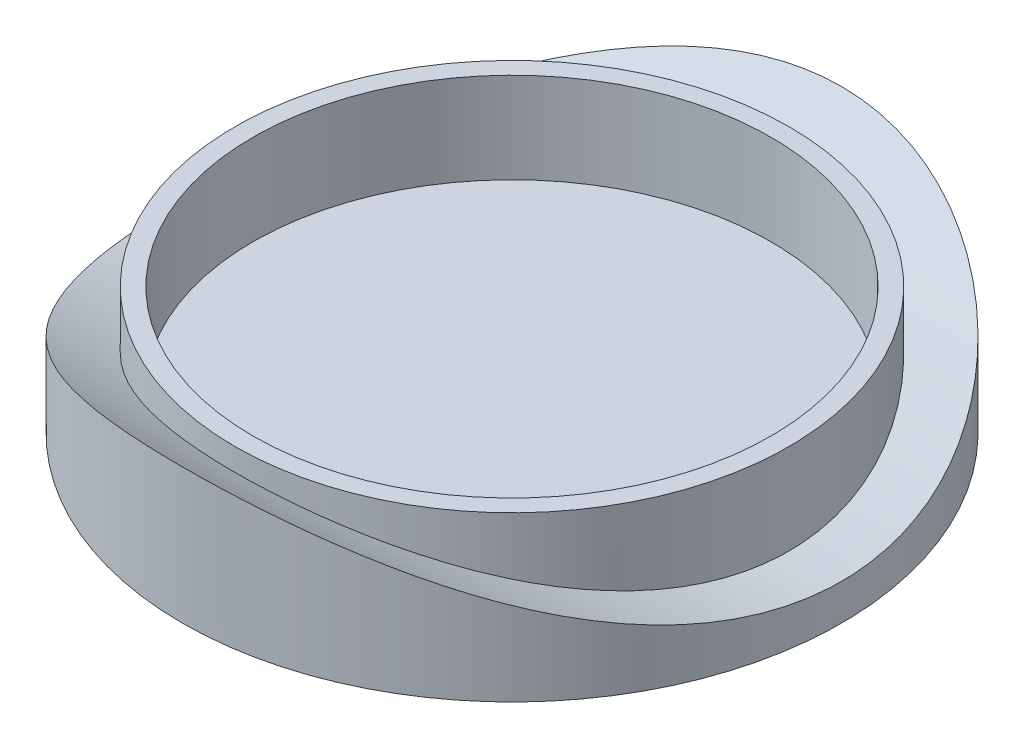
ISO-10303-21;
HEADER;
FILE_DESCRIPTION(('STEP AP214'),'2;1');
FILE_NAME('part.step','',(''),(''),'','','');
FILE_SCHEMA(('AUTOMOTIVE_DESIGN { 1 0 10303 214 1 1 1 1 }'));
ENDSEC;
DATA;
#1=APPLICATION_CONTEXT('core data for automotive mechanical design processes');
#2=APPLICATION_PROTOCOL_DEFINITION('international standard','automotive_design',2000,#1);
#3=PRODUCT_CONTEXT('',#1,'mechanical');
#4=PRODUCT('Part','Part','',(#3));
#5=PRODUCT_RELATED_PRODUCT_CATEGORY('part','',(#4));
#6=PRODUCT_DEFINITION_FORMATION('','',#4);
#7=PRODUCT_DEFINITION_CONTEXT('part definition',#1,'design');
#8=PRODUCT_DEFINITION('design','',#6,#7);
#9=PRODUCT_DEFINITION_SHAPE('','',#8);
#10=(LENGTH_UNIT() NAMED_UNIT(*) SI_UNIT(.MILLI.,.METRE.));
#11=(NAMED_UNIT(*) PLANE_ANGLE_UNIT() SI_UNIT($,.RADIAN.));
#12=(NAMED_UNIT(*) SI_UNIT($,.STERADIAN.) SOLID_ANGLE_UNIT());
#13=UNCERTAINTY_MEASURE_WITH_UNIT(LENGTH_MEASURE(1.E-05),#10,'distance_accuracy_value','');
#14=(GEOMETRIC_REPRESENTATION_CONTEXT(3) GLOBAL_UNCERTAINTY_ASSIGNED_CONTEXT((#13)) GLOBAL_UNIT_ASSIGNED_CONTEXT((#10,
#11,#12)) REPRESENTATION_CONTEXT('',''));
#15=CARTESIAN_POINT('',(0.,0.,0.));
#16=DIRECTION('',(0.,0.,1.));
#17=DIRECTION('',(1.,0.,0.));
#18=AXIS2_PLACEMENT_3D('',#15,#16,#17);
#19=CARTESIAN_POINT('',(-18.2,35.,0.));
#20=DIRECTION('',(1.,0.,0.));
#21=DIRECTION('',(0.,0.,-1.));
#22=AXIS2_PLACEMENT_3D('',#19,#20,#21);
#23=CYLINDRICAL_SURFACE('',#22,33.);
#24=CARTESIAN_POINT('',(0.,7.4725591454636,-18.2));
#25=CARTESIAN_POINT('',(0.466331520188418,7.47256646341348,-18.2000054410656));
#26=CARTESIAN_POINT('',(0.932604670972832,7.46067141752008,-18.1820565257804));
#27=CARTESIAN_POINT('',(1.86139151814629,7.41359579888765,-18.1105540895834));
#28=CARTESIAN_POINT('',(2.32390395310295,7.37840771486212,-18.0569890835557));
#29=CARTESIAN_POINT('',(3.24195847486375,7.28608086767691,-17.9149607667867));
#30=CARTESIAN_POINT('',(3.69748961472007,7.22891069860615,-17.8264475204406));
#31=CARTESIAN_POINT('',(4.59766027526353,7.0947971142261,-17.6157658458414));
#32=CARTESIAN_POINT('',(5.04230035022069,7.01785470746872,-17.4935991341776));
#33=CARTESIAN_POINT('',(5.91517444234529,6.84743012429949,-17.2179804127475));
#34=CARTESIAN_POINT('',(6.34349645350872,6.75405893954419,-17.0647373544043));
#35=CARTESIAN_POINT('',(7.18480607907141,6.55330512441851,-16.7279398202997));
#36=CARTESIAN_POINT('',(7.597787975018,6.44591733498856,-16.5443741771347));
#37=CARTESIAN_POINT('',(8.40651496232948,6.22016850840954,-16.1484734732091));
#38=CARTESIAN_POINT('',(8.80226175438158,6.10180855756935,-15.9361412595506));
#39=CARTESIAN_POINT('',(9.57517128492063,5.85708493057837,-15.4840744444795));
#40=CARTESIAN_POINT('',(9.95233338708389,5.73072098071566,-15.2443389057323));
#41=CARTESIAN_POINT('',(10.7242893595588,5.45974325762081,-14.7129529266069));
#42=CARTESIAN_POINT('',(11.1169653754086,5.31458171690369,-14.4185017697951));
#43=CARTESIAN_POINT('',(11.8766365811248,5.02181354003542,-13.7994759938546));
#44=CARTESIAN_POINT('',(12.2436377859735,4.87420748666322,-13.4749084719873));
#45=CARTESIAN_POINT('',(12.9507748260143,4.57995511049256,-12.7967792018255));
#46=CARTESIAN_POINT('',(13.2908914159621,4.43330954290588,-12.4431970460118));
#47=CARTESIAN_POINT('',(13.9423021461093,4.1444890019993,-11.708680073825));
#48=CARTESIAN_POINT('',(14.2535951449645,4.00231420585817,-11.3277441753697));
#49=CARTESIAN_POINT('',(14.8711957592552,3.71371572957544,-10.5059080717827));
#50=CARTESIAN_POINT('',(15.1747332270049,3.56799167749868,-10.0626722041972));
#51=CARTESIAN_POINT('',(15.7430523704397,3.28971293938486,-9.14801580400674));
#52=CARTESIAN_POINT('',(16.0078312084888,3.15715921781537,-8.67659321132198));
#53=CARTESIAN_POINT('',(16.4957435322228,2.90910656546688,-7.70869376662923));
#54=CARTESIAN_POINT('',(16.7189013479963,2.79359767921562,-7.21223176873179));
#55=CARTESIAN_POINT('',(17.1209903462412,2.58304532127191,-6.19753072550103));
#56=CARTESIAN_POINT('',(17.2999274522119,2.48799910876174,-5.6792946077708));
#57=CARTESIAN_POINT('',(17.5980386039285,2.32835333043952,-4.66933163655679));
#58=CARTESIAN_POINT('',(17.7209558586151,2.26187386896676,-4.17900571232701));
#59=CARTESIAN_POINT('',(17.9258583545083,2.15051019976615,-3.18744773977156));
#60=CARTESIAN_POINT('',(18.0078456817139,2.10562489149375,-2.6862162486085));
#61=CARTESIAN_POINT('',(18.1296465655529,2.03878805533231,-1.67745814802569));
#62=CARTESIAN_POINT('',(18.1694870977608,2.01682185845152,-1.16993577574481));
#63=CARTESIAN_POINT('',(18.2064686362156,1.99643587036973,-0.152881085806326));
#64=CARTESIAN_POINT('',(18.2036130499454,1.998014200132,0.356651068210303));
#65=CARTESIAN_POINT('',(18.1578175109985,2.02324970685733,1.3194229158806));
#66=CARTESIAN_POINT('',(18.119134909063,2.04456183434509,1.77293443658919));
#67=CARTESIAN_POINT('',(18.0081391221105,2.10545768786817,2.67454474628199));
#68=CARTESIAN_POINT('',(17.9358288392585,2.14503983714615,3.12264399893719));
#69=CARTESIAN_POINT('',(17.7584244751602,2.24154903593377,4.01039745265964));
#70=CARTESIAN_POINT('',(17.6533292311395,2.29847670062991,4.45005135361096));
#71=CARTESIAN_POINT('',(17.4115037003696,2.42838557399743,5.31813637426397));
#72=CARTESIAN_POINT('',(17.2747721805998,2.50136740837293,5.74656705581716));
#73=CARTESIAN_POINT('',(16.9694331506945,2.66264260918343,6.59419563976168));
#74=CARTESIAN_POINT('',(16.8005044362565,2.75108945152799,7.0132483682451));
#75=CARTESIAN_POINT('',(16.4332620842467,2.94087654696213,7.83521158087485));
#76=CARTESIAN_POINT('',(16.2349485909342,3.04221673675378,8.23812214425591));
#77=CARTESIAN_POINT('',(15.8104557005801,3.25575867817724,9.02606227963806));
#78=CARTESIAN_POINT('',(15.5842709947826,3.36796249817898,9.41108842582278));
#79=CARTESIAN_POINT('',(15.105579579088,3.60103776162541,10.1616750929136));
#80=CARTESIAN_POINT('',(14.8530704269851,3.72191000894349,10.5272338029999));
#81=CARTESIAN_POINT('',(14.2944895390302,3.98347059500395,11.2760239171027));
#82=CARTESIAN_POINT('',(13.9855785605702,4.12488770010289,11.6568853601896));
#83=CARTESIAN_POINT('',(13.3390263766242,4.41232652693227,12.3915234235819));
#84=CARTESIAN_POINT('',(13.0013833824372,4.55834853498255,12.7452983550184));
#85=CARTESIAN_POINT('',(12.2986876354565,4.85177117612977,13.4246540084065));
#86=CARTESIAN_POINT('',(11.933608395292,4.99917301800046,13.7502068141785));
#87=CARTESIAN_POINT('',(11.1778761020166,5.29169270866319,14.3713024684439));
#88=CARTESIAN_POINT('',(10.7872218922903,5.43681045378945,14.6668439581464));
#89=CARTESIAN_POINT('',(9.94608237685257,5.73370042260822,15.2512439522224));
#90=CARTESIAN_POINT('',(9.49336420834066,5.88491993188558,15.5371806535685));
#91=CARTESIAN_POINT('',(8.56147385049909,6.17530808595798,16.0695088704479));
#92=CARTESIAN_POINT('',(8.08229944015019,6.31447571646303,16.3158970590521));
#93=CARTESIAN_POINT('',(7.10047577579676,6.5754843352139,16.7664749397714));
#94=CARTESIAN_POINT('',(6.59784861437138,6.6973412093552,16.9707034004551));
#95=CARTESIAN_POINT('',(5.571962239076,6.91875775355617,17.3346271450477));
#96=CARTESIAN_POINT('',(5.0487063785315,7.0183210301481,17.4943296331431));
#97=CARTESIAN_POINT('',(4.02858433208946,7.18351217743513,17.7557022457545));
#98=CARTESIAN_POINT('',(3.53299042666581,7.25122845215653,17.8610123105251));
#99=CARTESIAN_POINT('',(2.53193071754668,7.36083722527409,18.0301667106052));
#100=CARTESIAN_POINT('',(2.02646555237618,7.40273138830951,18.0940137188719));
#101=CARTESIAN_POINT('',(1.01091804605277,7.4586641785897,18.1790382773901));
#102=CARTESIAN_POINT('',(0.500840789013534,7.47273042924424,18.2002581418486));
#103=CARTESIAN_POINT('',(-0.519253461440173,7.47238478291506,18.1997372014224));
#104=CARTESIAN_POINT('',(-1.02927045528828,7.45797603113853,18.1780011412357));
#105=CARTESIAN_POINT('',(-1.96955013237164,7.40557967593698,18.0983357117135));
#106=CARTESIAN_POINT('',(-2.4005310795556,7.37136343551335,18.0461871345147));
#107=CARTESIAN_POINT('',(-3.25573863544294,7.28395852691672,17.9116578081477));
#108=CARTESIAN_POINT('',(-3.67996604753212,7.23077213327748,17.829280683368));
#109=CARTESIAN_POINT('',(-4.51923461512074,7.10715018874479,17.6352524243006));
#110=CARTESIAN_POINT('',(-4.93427242137065,7.03670845822746,17.5235908013922));
#111=CARTESIAN_POINT('',(-5.75283641699896,6.88072477344661,17.2721805606715));
#112=CARTESIAN_POINT('',(-6.15636180473914,6.79518177061065,17.1324299923809));
#113=CARTESIAN_POINT('',(-6.96659455394913,6.60754159059913,16.8197176655141));
#114=CARTESIAN_POINT('',(-7.37273586985196,6.50490376888353,16.645616103698));
#115=CARTESIAN_POINT('',(-8.16905829221269,6.28856368702168,16.2696179723184));
#116=CARTESIAN_POINT('',(-8.55923273988248,6.1748568761528,16.0677099565975));
#117=CARTESIAN_POINT('',(-9.32216444175939,5.93918312249585,15.6374258237048));
#118=CARTESIAN_POINT('',(-9.69491889105745,5.81721485716768,15.4090454645092));
#119=CARTESIAN_POINT('',(-10.4217987121166,5.56775015074842,14.9270332682385));
#120=CARTESIAN_POINT('',(-10.7759224063823,5.44025321373997,14.6733991632671));
#121=CARTESIAN_POINT('',(-11.5194161057915,5.16177109116435,14.0995515591107));
#122=CARTESIAN_POINT('',(-11.9053922672413,5.01028455121638,13.7751723863166));
#123=CARTESIAN_POINT('',(-12.6491595674363,4.70732983076574,13.0955176718803));
#124=CARTESIAN_POINT('',(-13.0069481440979,4.55586165317858,12.7402393278481));
#125=CARTESIAN_POINT('',(-13.69276091093,4.25660314894936,12.0001231682837));
#126=CARTESIAN_POINT('',(-14.0207666348512,4.1088151447789,11.6152672831504));
#127=CARTESIAN_POINT('',(-14.6447936766217,3.82062542506606,10.8178700817278));
#128=CARTESIAN_POINT('',(-14.9408167507391,3.68022330415904,10.405330287668));
#129=CARTESIAN_POINT('',(-15.5132013533399,3.40326806928154,9.5324094908671));
#130=CARTESIAN_POINT('',(-15.7877570273716,3.26728853989956,9.07065796611433));
#131=CARTESIAN_POINT('',(-16.2965183375649,3.01112386459268,8.12117946634526));
#132=CARTESIAN_POINT('',(-16.530721763936,2.89093958374069,7.63345107068381));
#133=CARTESIAN_POINT('',(-16.9558584768007,2.6700112596181,6.63570952283829));
#134=CARTESIAN_POINT('',(-17.1468281558959,2.56925087670458,6.12571554766991));
#135=CARTESIAN_POINT('',(-17.4831197011992,2.39019801402738,5.08707676520219));
#136=CARTESIAN_POINT('',(-17.6284483891114,2.31190217676484,4.55843475827065));
#137=CARTESIAN_POINT('',(-17.8588295578949,2.18705372272557,3.54195007775683));
#138=CARTESIAN_POINT('',(-17.9485214183189,2.13807623657401,3.05545289068582));
#139=CARTESIAN_POINT('',(-18.0880899059481,2.06163990583628,2.07510694941269));
#140=CARTESIAN_POINT('',(-18.1379692744863,2.03417957966472,1.58125870376146));
#141=CARTESIAN_POINT('',(-18.1971779342208,2.0015655339483,0.590624665456921));
#142=CARTESIAN_POINT('',(-18.206525309772,1.99640186620012,0.0938402819296574));
#143=CARTESIAN_POINT('',(-18.1845787431744,2.00850396617728,-0.898542594230229));
#144=CARTESIAN_POINT('',(-18.1532868663792,2.02576859405979,-1.3941411458464));
#145=CARTESIAN_POINT('',(-18.0551785010101,2.07967213760992,-2.33533898320998));
#146=CARTESIAN_POINT('',(-17.9918235687849,2.114421582316,-2.78141346001073));
#147=CARTESIAN_POINT('',(-17.8326262282243,2.20124845033877,-3.66597335518863));
#148=CARTESIAN_POINT('',(-17.7367862941118,2.25332455396351,-4.10445934887063));
#149=CARTESIAN_POINT('',(-17.5136652091741,2.37363565747686,-4.97109401403255));
#150=CARTESIAN_POINT('',(-17.38638223044,2.44187159679134,-5.39924208293882));
#151=CARTESIAN_POINT('',(-17.1016554620544,2.59302435588338,-6.24271892556487));
#152=CARTESIAN_POINT('',(-16.9442102297529,2.67594187786149,-6.65804708500918));
#153=CARTESIAN_POINT('',(-16.5947762282696,2.85776004343077,-7.48750384194371));
#154=CARTESIAN_POINT('',(-16.4018007955547,2.95710573823956,-7.90111867495187));
#155=CARTESIAN_POINT('',(-15.9867673179579,3.16755203611124,-8.7103428970206));
#156=CARTESIAN_POINT('',(-15.7647089541381,3.2786527680831,-9.10595208855827));
#157=CARTESIAN_POINT('',(-15.2930565730593,3.51039248706514,-9.87759869830772));
#158=CARTESIAN_POINT('',(-15.0434552991148,3.63103398538196,-10.2536309200154));
#159=CARTESIAN_POINT('',(-14.5182821918074,3.87947631048308,-10.9846288139164));
#160=CARTESIAN_POINT('',(-14.2427075709453,4.00727790510149,-11.3395922182946));
#161=CARTESIAN_POINT('',(-13.6337877608426,4.2826085870197,-12.0668958691934));
#162=CARTESIAN_POINT('',(-13.2974457691362,4.43071218928489,-12.4365137477821));
#163=CARTESIAN_POINT('',(-12.5960462659109,4.72922757267057,-13.1464311616113));
#164=CARTESIAN_POINT('',(-12.2309865814149,4.87963952776236,-13.4867284741675));
#165=CARTESIAN_POINT('',(-11.473367828478,5.17925255925181,-14.1368770535749));
#166=CARTESIAN_POINT('',(-11.0807756774816,5.32845192995686,-14.4466905796355));
#167=CARTESIAN_POINT('',(-10.270134702835,5.62155760375586,-15.03378814666));
#168=CARTESIAN_POINT('',(-9.85208699687899,5.76546413880149,-15.3110736142928));
#169=CARTESIAN_POINT('',(-8.96303275804412,6.05337070719963,-15.8490358627124));
#170=CARTESIAN_POINT('',(-8.49035711244677,6.19671662614432,-16.107314901613));
#171=CARTESIAN_POINT('',(-7.52015256507213,6.46763634537074,-16.5824935998648));
#172=CARTESIAN_POINT('',(-7.02261937018063,6.59520740788494,-16.7993860800083));
#173=CARTESIAN_POINT('',(-6.00715360626932,6.82904707192011,-17.1886267894562));
#174=CARTESIAN_POINT('',(-5.48928095127663,6.9353733377791,-17.3610959747927));
#175=CARTESIAN_POINT('',(-4.43606760266035,7.12222285633109,-17.6595758678109));
#176=CARTESIAN_POINT('',(-3.90073824395344,7.20276249905715,-17.7856160935391));
#177=CARTESIAN_POINT('',(-2.8081730988795,7.33509351292254,-17.9907810389451));
#178=CARTESIAN_POINT('',(-2.25072058473993,7.38638084547436,-18.0690847103131));
#179=CARTESIAN_POINT('',(-1.12881674374812,7.45510872741814,-18.1736901207454));
#180=CARTESIAN_POINT('',(-0.564365626725553,7.47255028910456,-18.1999934150915));
#181=CARTESIAN_POINT('',(0.,7.4725591454636,-18.2));
#182=B_SPLINE_CURVE_WITH_KNOTS('',3,(#24,#25,#26,#27,#28,#29,#30,#31,#32,#33,#34,#35,#36,#37,
#38,#39,#40,#41,#42,#43,#44,#45,#46,#47,#48,#49,#50,#51,#52,#53,#54,#55,#56,#57,#58,#59,#60,#61,
#62,#63,#64,#65,#66,#67,#68,#69,#70,#71,#72,#73,#74,#75,#76,#77,#78,#79,#80,#81,#82,#83,#84,#85,
#86,#87,#88,#89,#90,#91,#92,#93,#94,#95,#96,#97,#98,#99,#100,#101,#102,#103,#104,#105,#106,#107,
#108,#109,#110,#111,#112,#113,#114,#115,#116,#117,#118,#119,#120,#121,#122,#123,#124,#125,#126,
#127,#128,#129,#130,#131,#132,#133,#134,#135,#136,#137,#138,#139,#140,#141,#142,#143,#144,#145,
#146,#147,#148,#149,#150,#151,#152,#153,#154,#155,#156,#157,#158,#159,#160,#161,#162,#163,#164,
#165,#166,#167,#168,#169,#170,#171,#172,#173,#174,#175,#176,#177,#178,#179,#180,#181),
.UNSPECIFIED.,.T.,.F.,(4,2,2,2,2,2,2,2,2,2,2,2,2,2,2,2,2,2,2,2,2,2,2,2,2,2,2,2,2,2,2,2,2,2,2,2,
2,2,2,2,2,2,2,2,2,2,2,2,2,2,2,2,2,2,2,2,2,2,2,2,2,2,2,2,2,2,2,2,2,2,2,2,2,2,2,2,2,2,4),(0.,
1.3984032358621,2.79725763346142,4.19811805205931,5.59890702906706,6.99057232379279,
8.38275129769199,9.77479258454816,11.1668815006222,12.7007826118412,14.2343231556053,
15.7689517194965,17.303641024985,18.9713347794882,20.6391505698751,22.3059883408924,
23.9726027127221,25.5000220040084,27.0273634422265,28.5537267304741,30.079968203687,
31.445316240645,32.810546466022,34.1758251171127,35.5411569887611,36.9208992889777,
38.3006348158208,39.6806335545388,41.0607604344195,42.5902723579537,44.1198795704441,
45.6509829433333,47.1821556075089,48.8492415156504,50.5164675902045,52.1821536463876,
53.847570042293,55.3787530201736,56.9098372790182,58.4394009411683,59.968795664764,
61.2737040874277,62.5784561032864,63.8836760726235,65.1889867069285,66.548602162437,
67.9087789677958,69.2691740348954,70.62969138177,72.2073273491282,73.7851065491623,
75.3638574325055,76.9425215775545,78.6027434636809,80.2630562388479,81.9219661829138,
83.5806280608428,85.0699327206422,86.5591348238783,88.0476724142155,89.5361343575873,
90.8902414316276,92.2442453931583,93.5983280868472,94.9524755620113,96.352334524573,
97.7522088399665,99.152452862556,100.552847332954,102.114859280116,103.676989533677,
105.241030086963,106.805002016328,108.474925703906,110.145138805542,111.810754984099,
113.475310382046,115.167742246629,116.860123491421),.UNSPECIFIED.);
#183=CARTESIAN_POINT('',(0.,7.4725591454636,-18.2));
#184=VERTEX_POINT('',#183);
#185=EDGE_CURVE('E51',#184,#184,#182,.T.);
#186=ORIENTED_EDGE('',*,*,#185,.F.);
#187=EDGE_LOOP('',(#186));
#188=FACE_BOUND('',#187,.T.);
#189=CARTESIAN_POINT('',(0.,5.76115597360251,-15.3));
#190=CARTESIAN_POINT('',(-0.403146957239504,5.76115229441168,-15.299996887044));
#191=CARTESIAN_POINT('',(-0.806379777429665,5.75278916809838,-15.2840436028974));
#192=CARTESIAN_POINT('',(-1.60982188428048,5.71962733156843,-15.2204145901529));
#193=CARTESIAN_POINT('',(-2.01002937626418,5.69481953810566,-15.1727213298556));
#194=CARTESIAN_POINT('',(-2.80504228606355,5.62959001396996,-15.0460656339419));
#195=CARTESIAN_POINT('',(-3.19983447275594,5.58913533687331,-14.9670372094196));
#196=CARTESIAN_POINT('',(-3.98028559589403,5.4940239109833,-14.7786494660663));
#197=CARTESIAN_POINT('',(-4.36594565032436,5.43936891054963,-14.6692938810376));
#198=CARTESIAN_POINT('',(-5.12391440936897,5.31793161393153,-14.4219859039722));
#199=CARTESIAN_POINT('',(-5.49627794212243,5.25120830011729,-14.2841721528663));
#200=CARTESIAN_POINT('',(-6.22749244304799,5.10747387367851,-13.980880614763));
#201=CARTESIAN_POINT('',(-6.58634303377394,5.03046247395797,-13.8154020557281));
#202=CARTESIAN_POINT('',(-7.28860411097192,4.86833821792153,-13.4581353339042));
#203=CARTESIAN_POINT('',(-7.63201997012285,4.78322821331569,-13.2663564216722));
#204=CARTESIAN_POINT('',(-8.30210188165289,4.60706762010758,-12.857650944047));
#205=CARTESIAN_POINT('',(-8.6287617397578,4.51601486248368,-12.6407151740589));
#206=CARTESIAN_POINT('',(-9.28611694718188,4.3236841102032,-12.1669021379751));
#207=CARTESIAN_POINT('',(-9.6154839687648,4.22213712739228,-11.908289633459));
#208=CARTESIAN_POINT('',(-10.2516669688666,4.01748976509271,-11.365221352698));
#209=CARTESIAN_POINT('',(-10.5584819099588,3.91438931440497,-11.0807643889167));
#210=CARTESIAN_POINT('',(-11.1481538481028,3.70918856999328,-10.4873130431932));
#211=CARTESIAN_POINT('',(-11.430996337028,3.60708891453805,-10.1783040184208));
#212=CARTESIAN_POINT('',(-11.9708198772317,3.40652365035897,-9.53755249081066));
#213=CARTESIAN_POINT('',(-12.2278097018707,3.30805681603333,-9.20581776484697));
#214=CARTESIAN_POINT('',(-12.7281109939503,3.11177475765074,-8.50188052209675));
#215=CARTESIAN_POINT('',(-12.969837437571,3.01430842617189,-8.12845113906628));
#216=CARTESIAN_POINT('',(-13.4207477186903,2.82882923713855,-7.36015806607428));
#217=CARTESIAN_POINT('',(-13.6299299976428,2.74081683239677,-6.96529335079156));
#218=CARTESIAN_POINT('',(-14.0136731393955,2.57681466979347,-6.15687132236773));
#219=CARTESIAN_POINT('',(-14.1882485730831,2.50081985477637,-5.7433219666631));
#220=CARTESIAN_POINT('',(-14.500976234638,2.36307940168356,-4.90037945440922));
#221=CARTESIAN_POINT('',(-14.6391317110505,2.30133249280095,-4.47098771484795));
#222=CARTESIAN_POINT('',(-14.8698841696176,2.19735475653917,-3.62708485685766));
#223=CARTESIAN_POINT('',(-14.9647924541694,2.15414388568378,-3.21332591152479));
#224=CARTESIAN_POINT('',(-15.1200275907563,2.08312809048173,-2.37806057725593));
#225=CARTESIAN_POINT('',(-15.1803557661257,2.05532257659405,-1.95655448543007));
#226=CARTESIAN_POINT('',(-15.2656599593296,2.01592896250042,-1.10940808586734));
#227=CARTESIAN_POINT('',(-15.2906512413326,2.0043338600493,-0.683769643194837));
#228=CARTESIAN_POINT('',(-15.3050055828101,1.99767968201677,0.168227693547697));
#229=CARTESIAN_POINT('',(-15.2943704371449,2.00261977339184,0.594586550241612));
#230=CARTESIAN_POINT('',(-15.2397546329104,2.02789648358495,1.41245692513999));
#231=CARTESIAN_POINT('',(-15.1983395497167,2.04704833982016,1.80417968597677));
#232=CARTESIAN_POINT('',(-15.0856198260798,2.09888424232569,2.58236844744241));
#233=CARTESIAN_POINT('',(-15.014316987517,2.13156747281171,2.96883476352318));
#234=CARTESIAN_POINT('',(-14.8425598371481,2.20967002161022,3.73391887143717));
#235=CARTESIAN_POINT('',(-14.7421045680467,2.25508975815711,4.11253640509785));
#236=CARTESIAN_POINT('',(-14.5130166282134,2.3575864228597,4.85952488498912));
#237=CARTESIAN_POINT('',(-14.3843830169819,2.41466374010244,5.22789548874861));
#238=CARTESIAN_POINT('',(-14.0979618362357,2.54009073942713,5.9576338028656));
#239=CARTESIAN_POINT('',(-13.9397681201866,2.60859582538222,6.31881516759414));
#240=CARTESIAN_POINT('',(-13.596840256439,2.75469014236033,7.02641615720686));
#241=CARTESIAN_POINT('',(-13.412106089137,2.83227938009314,7.37283577118737));
#242=CARTESIAN_POINT('',(-13.01742368863,2.9948288017884,8.04922491267466));
#243=CARTESIAN_POINT('',(-12.8074726994273,3.07978979114235,8.3791926365339));
#244=CARTESIAN_POINT('',(-12.3636426341386,3.25526658103364,9.02123703919716));
#245=CARTESIAN_POINT('',(-12.1297542678927,3.34578453274744,9.33330669783569));
#246=CARTESIAN_POINT('',(-11.6188184966492,3.53817674760749,9.9634899380219));
#247=CARTESIAN_POINT('',(-11.3397959358986,3.64036613360066,10.2799078893653));
#248=CARTESIAN_POINT('',(-10.7568946916764,3.84640537277527,10.8883764839877));
#249=CARTESIAN_POINT('',(-10.4530149041007,3.95025529954933,11.1804260437102));
#250=CARTESIAN_POINT('',(-9.82185841849637,4.15701097312796,11.7387692254898));
#251=CARTESIAN_POINT('',(-9.4945702986739,4.25991623097916,12.0050501228893));
#252=CARTESIAN_POINT('',(-8.81831807162493,4.46201362587836,12.5102128686246));
#253=CARTESIAN_POINT('',(-8.46935041146582,4.56120515001277,12.7490902075953));
#254=CARTESIAN_POINT('',(-7.73395325453263,4.75777007431771,13.2088252772476));
#255=CARTESIAN_POINT('',(-7.34652636912766,4.85481751928678,13.4282311419425));
#256=CARTESIAN_POINT('',(-6.5522058634529,5.03848769868014,13.8331929291361));
#257=CARTESIAN_POINT('',(-6.14532113851635,5.12511513422657,14.0187641362176));
#258=CARTESIAN_POINT('',(-5.31474265427748,5.28484323096608,14.354232496752));
#259=CARTESIAN_POINT('',(-4.89105726487595,5.35795052742794,14.5041471597318));
#260=CARTESIAN_POINT('',(-4.02983270910762,5.4878249579189,14.7666184962515));
#261=CARTESIAN_POINT('',(-3.59229514499622,5.54459397415728,14.8791794732551));
#262=CARTESIAN_POINT('',(-2.73989406289925,5.63588921526385,15.0584975163144));
#263=CARTESIAN_POINT('',(-2.32575780189998,5.67175354966398,15.1280340265629));
#264=CARTESIAN_POINT('',(-1.49203697392851,5.72606597070728,15.2328691723483));
#265=CARTESIAN_POINT('',(-1.07245268654388,5.74451494753704,15.2681695578685));
#266=CARTESIAN_POINT('',(-0.231581458503668,5.7632590303384,15.3040317854239));
#267=CARTESIAN_POINT('',(0.189704654255358,5.76356209852968,15.3046088636546));
#268=CARTESIAN_POINT('',(1.03049840960297,5.74602077537236,15.2710530994981));
#269=CARTESIAN_POINT('',(1.4500061358132,5.72817724701751,15.2369219077247));
#270=CARTESIAN_POINT('',(2.24713264819627,5.67739017669027,15.1389321238434));
#271=CARTESIAN_POINT('',(2.62520197766592,5.64590616499405,15.0779392572921));
#272=CARTESIAN_POINT('',(3.3743668088705,5.56944596136142,14.9281463650817));
#273=CARTESIAN_POINT('',(3.74546280056149,5.5244707211318,14.839348300855));
#274=CARTESIAN_POINT('',(4.47850570272622,5.4223866197237,14.6348156749036));
#275=CARTESIAN_POINT('',(4.84045075481926,5.3652753157418,14.5190756897352));
#276=CARTESIAN_POINT('',(5.55314874328198,5.24055905727151,14.2617006979026));
#277=CARTESIAN_POINT('',(5.90390106350804,5.17295352628843,14.120064268555));
#278=CARTESIAN_POINT('',(6.60820179723737,5.02577156674956,13.8049707080337));
#279=CARTESIAN_POINT('',(6.96114746429933,4.94578966107765,13.6303564784005));
#280=CARTESIAN_POINT('',(7.65132102437513,4.77847529316333,13.2552486793246));
#281=CARTESIAN_POINT('',(7.98854354081099,4.69114034475688,13.0547463444353));
#282=CARTESIAN_POINT('',(8.64573749671279,4.51133252092314,12.6291142371439));
#283=CARTESIAN_POINT('',(8.96570477803528,4.41885841787424,12.4039785678739));
#284=CARTESIAN_POINT('',(9.58694925005969,4.23099104043128,11.9303393497515));
#285=CARTESIAN_POINT('',(9.88822531616595,4.13559759090333,11.6818343970963));
#286=CARTESIAN_POINT('',(10.5015116981611,3.93395326049355,11.1352713224208));
#287=CARTESIAN_POINT('',(10.8113048874376,3.82761802665061,10.8347510632886));
#288=CARTESIAN_POINT('',(11.4046232853389,3.61690687657653,10.2083602901488));
#289=CARTESIAN_POINT('',(11.6881560956754,3.51253040035498,9.88249716282272));
#290=CARTESIAN_POINT('',(12.227411346374,3.308403713805,9.20691440346325));
#291=CARTESIAN_POINT('',(12.4831225207581,3.20865538688826,8.85718519978898));
#292=CARTESIAN_POINT('',(12.9647753302345,3.01646315469785,8.13588676986694));
#293=CARTESIAN_POINT('',(13.1907174747115,2.92401912444953,7.76431791747974));
#294=CARTESIAN_POINT('',(13.6139024118924,2.74770062585973,6.99618304450143));
#295=CARTESIAN_POINT('',(13.810703417619,2.66396288451904,6.59934168486366));
#296=CARTESIAN_POINT('',(14.1698925091341,2.50893052868395,5.78800070901106));
#297=CARTESIAN_POINT('',(14.3322798317406,2.43763619014935,5.37350070143045));
#298=CARTESIAN_POINT('',(14.6207510676994,2.30963974203806,4.53013508683406));
#299=CARTESIAN_POINT('',(14.7468572935812,2.25292866618248,4.10127849094687));
#300=CARTESIAN_POINT('',(14.9613345215767,2.15578638732731,3.23243401258109));
#301=CARTESIAN_POINT('',(15.0497092300377,2.1153535853437,2.79244722791458));
#302=CARTESIAN_POINT('',(15.1818505227275,2.05465952067788,1.94191315355985));
#303=CARTESIAN_POINT('',(15.2287029283294,2.03300608642223,1.53194207698983));
#304=CARTESIAN_POINT('',(15.2891278621136,2.00505036917065,0.709040709505862));
#305=CARTESIAN_POINT('',(15.3027023145621,1.99874719856033,0.296110591080575));
#306=CARTESIAN_POINT('',(15.2964088382684,2.00166489862179,-0.529341507250735));
#307=CARTESIAN_POINT('',(15.2765484523841,2.01088226787916,-0.941863558209598));
#308=CARTESIAN_POINT('',(15.2036408414603,2.04458088949278,-1.76332786047301));
#309=CARTESIAN_POINT('',(15.1505941550105,2.06906189413121,-2.17227016976497));
#310=CARTESIAN_POINT('',(15.0155083295282,2.13098577498388,-2.96258173933802));
#311=CARTESIAN_POINT('',(14.9350979304854,2.16769846081086,-3.34428852431997));
#312=CARTESIAN_POINT('',(14.7457944760759,2.25337676872797,-4.09913984911665));
#313=CARTESIAN_POINT('',(14.6369026938958,2.30234184310248,-4.47228477085653));
#314=CARTESIAN_POINT('',(14.3916396680977,2.41139412163055,-5.20778384235748));
#315=CARTESIAN_POINT('',(14.2552657161051,2.47148242193323,-5.57013692453721));
#316=CARTESIAN_POINT('',(13.9562013172707,2.60142868463184,-6.28199907815781));
#317=CARTESIAN_POINT('',(13.7935096931073,2.67128708407448,-6.63150757413698));
#318=CARTESIAN_POINT('',(13.4350837426643,2.8226182562104,-7.33144357164128));
#319=CARTESIAN_POINT('',(13.238183864146,2.90447454760085,-7.68119114203226));
#320=CARTESIAN_POINT('',(12.8184294392541,3.07531694880751,-8.36290132709819));
#321=CARTESIAN_POINT('',(12.5955743213967,3.16430321559839,-8.69486354993949));
#322=CARTESIAN_POINT('',(12.1253036025047,3.34741593339865,-9.33949794913915));
#323=CARTESIAN_POINT('',(11.8778832602833,3.44154337509215,-9.65216638276296));
#324=CARTESIAN_POINT('',(11.3598304810568,3.63285499950176,-10.2568431383366));
#325=CARTESIAN_POINT('',(11.0891890324426,3.73004035957969,-10.548843358442));
#326=CARTESIAN_POINT('',(10.5018881594453,3.93366123970238,-11.1349421937885));
#327=CARTESIAN_POINT('',(10.1832728949417,4.04017292758946,-11.4270580101168));
#328=CARTESIAN_POINT('',(9.52210920949685,4.25130186000875,-11.9835788056203));
#329=CARTESIAN_POINT('',(9.17956050319561,4.35591908193439,-12.2479834542994));
#330=CARTESIAN_POINT('',(8.47207090193461,4.56036712095389,-12.7476143342131));
#331=CARTESIAN_POINT('',(8.10711503705227,4.66019465702606,-12.9828207343692));
#332=CARTESIAN_POINT('',(7.35690502499189,4.85198907812745,-13.422180373776));
#333=CARTESIAN_POINT('',(6.9716480780799,4.94395487432936,-13.6263293147049));
#334=CARTESIAN_POINT('',(6.17820463407854,5.11808882822105,-14.0041140802789));
#335=CARTESIAN_POINT('',(5.76979378696705,5.20012202080689,-14.1773421150067));
#336=CARTESIAN_POINT('',(4.93735346770764,5.35004196373145,-14.4882644155026));
#337=CARTESIAN_POINT('',(4.51333212536892,5.41793595835132,-14.6259768864927));
#338=CARTESIAN_POINT('',(3.65381003709391,5.5368084340352,-14.8639839511412));
#339=CARTESIAN_POINT('',(3.21834249564764,5.5878310307865,-14.9643762173404));
#340=CARTESIAN_POINT('',(2.33876671994319,5.6710295303689,-15.1267942062928));
#341=CARTESIAN_POINT('',(1.8946650721952,5.70321925866534,-15.1888480756646));
#342=CARTESIAN_POINT('',(1.20784061634347,5.73720782445476,-15.2541654257132));
#343=CARTESIAN_POINT('',(0.966702214862335,5.74617600203873,-15.2713438193624));
#344=CARTESIAN_POINT('',(0.483719531507255,5.75815130977404,-15.2942622887624));
#345=CARTESIAN_POINT('',(0.241875219429293,5.76115818099879,-15.3000018676736));
#346=CARTESIAN_POINT('',(0.,5.76115597360251,-15.3));
#347=B_SPLINE_CURVE_WITH_KNOTS('',3,(#189,#190,#191,#192,#193,#194,#195,#196,#197,#198,#199,
#200,#201,#202,#203,#204,#205,#206,#207,#208,#209,#210,#211,#212,#213,#214,#215,#216,#217,#218,
#219,#220,#221,#222,#223,#224,#225,#226,#227,#228,#229,#230,#231,#232,#233,#234,#235,#236,#237,
#238,#239,#240,#241,#242,#243,#244,#245,#246,#247,#248,#249,#250,#251,#252,#253,#254,#255,#256,
#257,#258,#259,#260,#261,#262,#263,#264,#265,#266,#267,#268,#269,#270,#271,#272,#273,#274,#275,
#276,#277,#278,#279,#280,#281,#282,#283,#284,#285,#286,#287,#288,#289,#290,#291,#292,#293,#294,
#295,#296,#297,#298,#299,#300,#301,#302,#303,#304,#305,#306,#307,#308,#309,#310,#311,#312,#313,
#314,#315,#316,#317,#318,#319,#320,#321,#322,#323,#324,#325,#326,#327,#328,#329,#330,#331,#332,
#333,#334,#335,#336,#337,#338,#339,#340,#341,#342,#343,#344,#345,#346),.UNSPECIFIED.,.T.,.F.,(4,
2,2,2,2,2,2,2,2,2,2,2,2,2,2,2,2,2,2,2,2,2,2,2,2,2,2,2,2,2,2,2,2,2,2,2,2,2,2,2,2,2,2,2,2,2,2,2,2,
2,2,2,2,2,2,2,2,2,2,2,2,2,2,2,2,2,2,2,2,2,2,2,2,2,2,2,2,2,4),(0.,1.2091909662196,
2.4190503887384,3.6314713098447,4.8437430270118,6.05024259677023,7.25677584175203,
8.4628857990681,9.66943845838258,10.9607437797497,12.2521084658109,13.5442491866852,
14.8359499168448,16.2003841345882,17.5648836752342,18.9288074801876,20.292609586251,
21.5710020233479,22.8493455348107,24.1271366825427,25.4048634560894,26.5865837670385,
27.7682328443855,28.9499207286203,30.1316480596828,31.3309976202393,32.5303480666712,
33.7298297120271,34.9297786575306,36.230558392914,37.5313959375239,38.8328725971922,
40.1345631137845,41.4998906073587,42.8645997867809,44.2286374211406,45.5925178521183,
46.8551742526108,48.1177661088824,49.3798039500508,50.6417817755656,51.7932212745999,
52.9445795671517,54.0961698303541,55.2478233779494,56.4520281328434,57.6566416936,
58.8615442551429,60.0665192419774,61.398534947172,62.7301638546276,64.0623299950893,
65.3944733375916,66.745103448043,68.0957635078805,69.445591140316,70.7952861493705,
72.0333096322558,73.2712615259125,74.5089341765851,75.7465867412427,76.9206821505754,
78.0947250839728,79.2688837762252,80.4430950090329,81.6706634601078,82.8982589449529,
84.126091822931,85.354403370363,86.6884422473588,88.022497032907,89.3574529909693,
90.6925935378803,92.044216146898,93.3951445329834,94.7425120223995,96.0888891458227,
96.8143333601964,97.5398090832155),.UNSPECIFIED.);
#348=CARTESIAN_POINT('',(0.,5.76115597360251,-15.3));
#349=VERTEX_POINT('',#348);
#350=EDGE_CURVE('E10',#349,#349,#347,.T.);
#351=ORIENTED_EDGE('',*,*,#350,.F.);
#352=EDGE_LOOP('',(#351));
#353=FACE_BOUND('',#352,.T.);
#354=ADVANCED_FACE('F37',(#188,#353),#23,.F.);
#355=CARTESIAN_POINT('',(0.,10.,0.));
#356=DIRECTION('',(0.,-1.,0.));
#357=DIRECTION('',(0.,0.,-1.));
#358=AXIS2_PLACEMENT_3D('',#355,#356,#357);
#359=CYLINDRICAL_SURFACE('',#358,18.2);
#360=ORIENTED_EDGE('',*,*,#185,.T.);
#361=EDGE_LOOP('',(#360));
#362=FACE_BOUND('',#361,.T.);
#363=CARTESIAN_POINT('',(0.,0.,0.));
#364=DIRECTION('',(0.,1.,0.));
#365=DIRECTION('',(0.,0.,1.));
#366=AXIS2_PLACEMENT_3D('',#363,#364,#365);
#367=CIRCLE('',#366,18.2);
#368=CARTESIAN_POINT('',(0.,0.,18.2));
#369=VERTEX_POINT('',#368);
#370=EDGE_CURVE('E56',#369,#369,#367,.T.);
#371=ORIENTED_EDGE('',*,*,#370,.T.);
#372=EDGE_LOOP('',(#371));
#373=FACE_BOUND('',#372,.T.);
#374=ADVANCED_FACE('F39',(#362,#373),#359,.T.);
#375=CARTESIAN_POINT('',(0.,0.,0.));
#376=DIRECTION('',(0.,1.,0.));
#377=DIRECTION('',(0.,0.,1.));
#378=AXIS2_PLACEMENT_3D('',#375,#376,#377);
#379=PLANE('',#378);
#380=ORIENTED_EDGE('',*,*,#370,.F.);
#381=EDGE_LOOP('',(#380));
#382=FACE_BOUND('',#381,.T.);
#383=ADVANCED_FACE('F73',(#382),#379,.F.);
#384=CARTESIAN_POINT('',(0.,7.,0.));
#385=DIRECTION('',(0.,-1.,0.));
#386=DIRECTION('',(0.,0.,-1.));
#387=AXIS2_PLACEMENT_3D('',#384,#385,#386);
#388=CYLINDRICAL_SURFACE('',#387,15.3);
#389=CARTESIAN_POINT('',(0.,7.,0.));
#390=DIRECTION('',(0.,1.,0.));
#391=DIRECTION('',(0.,0.,1.));
#392=AXIS2_PLACEMENT_3D('',#389,#390,#391);
#393=CIRCLE('',#392,15.3);
#394=CARTESIAN_POINT('',(0.,7.,15.3));
#395=VERTEX_POINT('',#394);
#396=EDGE_CURVE('E61',#395,#395,#393,.T.);
#397=ORIENTED_EDGE('',*,*,#396,.F.);
#398=EDGE_LOOP('',(#397));
#399=FACE_BOUND('',#398,.T.);
#400=ORIENTED_EDGE('',*,*,#350,.T.);
#401=EDGE_LOOP('',(#400));
#402=FACE_BOUND('',#401,.T.);
#403=ADVANCED_FACE('F70',(#399,#402),#388,.T.);
#404=CARTESIAN_POINT('',(0.,7.,0.));
#405=DIRECTION('',(0.,1.,0.));
#406=DIRECTION('',(0.,0.,1.));
#407=AXIS2_PLACEMENT_3D('',#404,#405,#406);
#408=PLANE('',#407);
#409=CARTESIAN_POINT('',(0.,7.,0.));
#410=DIRECTION('',(0.,1.,0.));
#411=DIRECTION('',(0.,0.,1.));
#412=AXIS2_PLACEMENT_3D('',#409,#410,#411);
#413=CIRCLE('',#412,14.3);
#414=CARTESIAN_POINT('',(0.,7.,14.3));
#415=VERTEX_POINT('',#414);
#416=EDGE_CURVE('E137',#415,#415,#413,.T.);
#417=ORIENTED_EDGE('',*,*,#416,.F.);
#418=EDGE_LOOP('',(#417));
#419=FACE_BOUND('',#418,.T.);
#420=ORIENTED_EDGE('',*,*,#396,.T.);
#421=EDGE_LOOP('',(#420));
#422=FACE_BOUND('',#421,.T.);
#423=ADVANCED_FACE('F81',(#419,#422),#408,.T.);
#424=CARTESIAN_POINT('',(0.,2.,0.));
#425=DIRECTION('',(0.,1.,0.));
#426=DIRECTION('',(0.,0.,1.));
#427=AXIS2_PLACEMENT_3D('',#424,#425,#426);
#428=CYLINDRICAL_SURFACE('',#427,14.3);
#429=CARTESIAN_POINT('',(0.,2.,0.));
#430=DIRECTION('',(0.,1.,0.));
#431=DIRECTION('',(0.,0.,1.));
#432=AXIS2_PLACEMENT_3D('',#429,#430,#431);
#433=CIRCLE('',#432,14.3);
#434=CARTESIAN_POINT('',(0.,2.,14.3));
#435=VERTEX_POINT('',#434);
#436=EDGE_CURVE('E135',#435,#435,#433,.T.);
#437=ORIENTED_EDGE('',*,*,#436,.F.);
#438=EDGE_LOOP('',(#437));
#439=FACE_BOUND('',#438,.T.);
#440=ORIENTED_EDGE('',*,*,#416,.T.);
#441=EDGE_LOOP('',(#440));
#442=FACE_BOUND('',#441,.T.);
#443=ADVANCED_FACE('F110',(#439,#442),#428,.F.);
#444=CARTESIAN_POINT('',(0.,2.,0.));
#445=DIRECTION('',(0.,1.,0.));
#446=DIRECTION('',(0.,0.,1.));
#447=AXIS2_PLACEMENT_3D('',#444,#445,#446);
#448=PLANE('',#447);
#449=ORIENTED_EDGE('',*,*,#436,.T.);
#450=EDGE_LOOP('',(#449));
#451=FACE_BOUND('',#450,.T.);
#452=ADVANCED_FACE('F119',(#451),#448,.T.);
#453=CLOSED_SHELL('',(#354,#374,#383,#403,#423,#443,#452));
#454=MANIFOLD_SOLID_BREP('B2',#453);
#455=ADVANCED_BREP_SHAPE_REPRESENTATION('',(#18,#454),#14);
#456=SHAPE_DEFINITION_REPRESENTATION(#9,#455);
ENDSEC;
END-ISO-10303-21;
